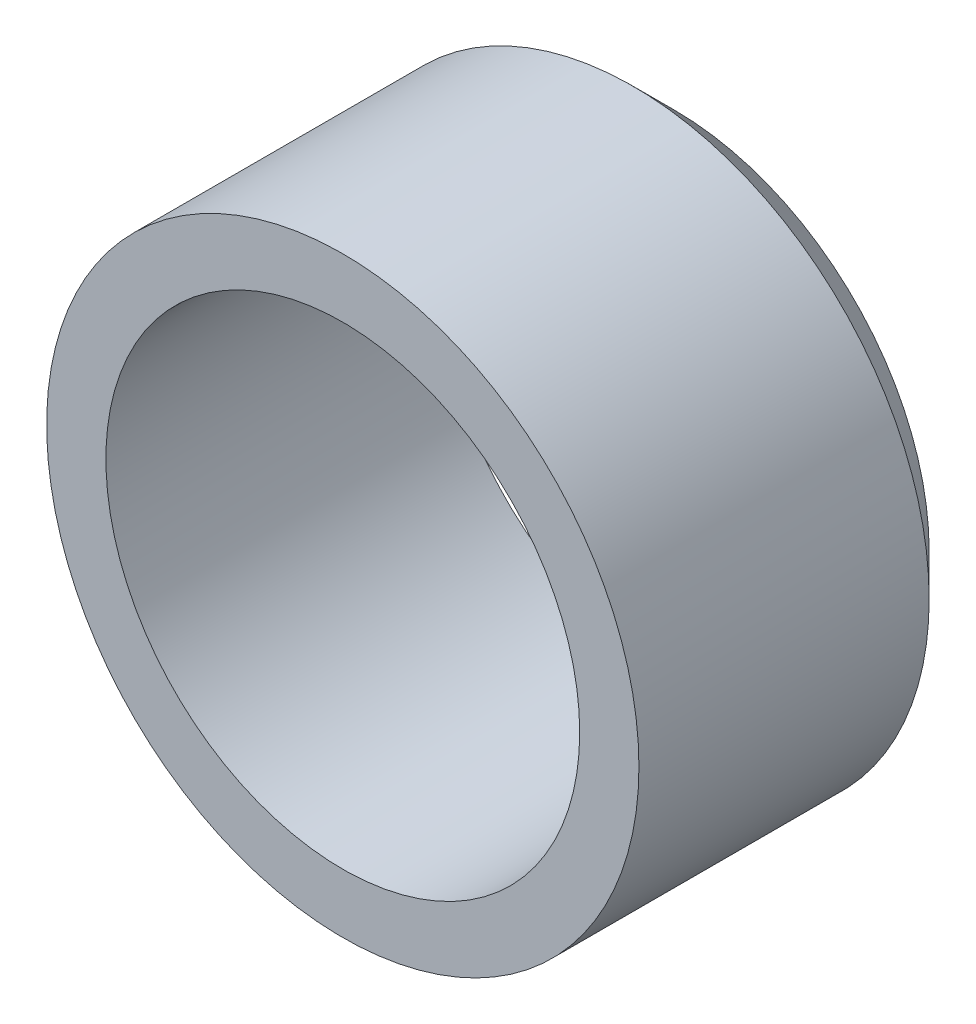
ISO-10303-21;
HEADER;
FILE_DESCRIPTION(('STEP AP214'),'2;1');
FILE_NAME('part.step','',(''),(''),'','','');
FILE_SCHEMA(('AUTOMOTIVE_DESIGN { 1 0 10303 214 1 1 1 1 }'));
ENDSEC;
DATA;
#1=APPLICATION_CONTEXT('core data for automotive mechanical design processes');
#2=APPLICATION_PROTOCOL_DEFINITION('international standard','automotive_design',2000,#1);
#3=PRODUCT_CONTEXT('',#1,'mechanical');
#4=PRODUCT('Part','Part','',(#3));
#5=PRODUCT_RELATED_PRODUCT_CATEGORY('part','',(#4));
#6=PRODUCT_DEFINITION_FORMATION('','',#4);
#7=PRODUCT_DEFINITION_CONTEXT('part definition',#1,'design');
#8=PRODUCT_DEFINITION('design','',#6,#7);
#9=PRODUCT_DEFINITION_SHAPE('','',#8);
#10=(LENGTH_UNIT() NAMED_UNIT(*) SI_UNIT(.MILLI.,.METRE.));
#11=(NAMED_UNIT(*) PLANE_ANGLE_UNIT() SI_UNIT($,.RADIAN.));
#12=(NAMED_UNIT(*) SI_UNIT($,.STERADIAN.) SOLID_ANGLE_UNIT());
#13=UNCERTAINTY_MEASURE_WITH_UNIT(LENGTH_MEASURE(1.E-05),#10,'distance_accuracy_value','');
#14=(GEOMETRIC_REPRESENTATION_CONTEXT(3) GLOBAL_UNCERTAINTY_ASSIGNED_CONTEXT((#13)) GLOBAL_UNIT_ASSIGNED_CONTEXT((#10,
#11,#12)) REPRESENTATION_CONTEXT('',''));
#15=CARTESIAN_POINT('',(0.,0.,0.));
#16=DIRECTION('',(0.,0.,1.));
#17=DIRECTION('',(1.,0.,0.));
#18=AXIS2_PLACEMENT_3D('',#15,#16,#17);
#19=CARTESIAN_POINT('',(0.,2.,0.));
#20=DIRECTION('',(0.,0.,-1.));
#21=DIRECTION('',(-1.,0.,0.));
#22=AXIS2_PLACEMENT_3D('',#19,#20,#21);
#23=PLANE('',#22);
#24=CARTESIAN_POINT('',(0.,0.,0.));
#25=DIRECTION('',(0.,0.,1.));
#26=DIRECTION('',(1.,0.,0.));
#27=AXIS2_PLACEMENT_3D('',#24,#25,#26);
#28=CIRCLE('',#27,2.);
#29=CARTESIAN_POINT('',(2.,0.,0.));
#30=VERTEX_POINT('',#29);
#31=EDGE_CURVE('E46',#30,#30,#28,.T.);
#32=ORIENTED_EDGE('',*,*,#31,.F.);
#33=EDGE_LOOP('',(#32));
#34=FACE_BOUND('',#33,.T.);
#35=CARTESIAN_POINT('',(0.,0.,0.));
#36=DIRECTION('',(0.,0.,1.));
#37=DIRECTION('',(1.,0.,0.));
#38=AXIS2_PLACEMENT_3D('',#35,#36,#37);
#39=CIRCLE('',#38,2.5);
#40=CARTESIAN_POINT('',(2.5,0.,0.));
#41=VERTEX_POINT('',#40);
#42=EDGE_CURVE('E42',#41,#41,#39,.T.);
#43=ORIENTED_EDGE('',*,*,#42,.T.);
#44=EDGE_LOOP('',(#43));
#45=FACE_BOUND('',#44,.T.);
#46=ADVANCED_FACE('F31',(#34,#45),#23,.F.);
#47=CARTESIAN_POINT('',(0.,0.,20.7004155612658));
#48=DIRECTION('',(0.,0.,1.));
#49=DIRECTION('',(1.,0.,0.));
#50=AXIS2_PLACEMENT_3D('',#47,#48,#49);
#51=CYLINDRICAL_SURFACE('',#50,2.5);
#52=CARTESIAN_POINT('',(0.,0.,-2.45));
#53=DIRECTION('',(0.,0.,1.));
#54=DIRECTION('',(1.,0.,0.));
#55=AXIS2_PLACEMENT_3D('',#52,#53,#54);
#56=CIRCLE('',#55,2.5);
#57=CARTESIAN_POINT('',(2.5,0.,-2.45));
#58=VERTEX_POINT('',#57);
#59=EDGE_CURVE('E38',#58,#58,#56,.T.);
#60=ORIENTED_EDGE('',*,*,#59,.T.);
#61=EDGE_LOOP('',(#60));
#62=FACE_BOUND('',#61,.T.);
#63=ORIENTED_EDGE('',*,*,#42,.F.);
#64=EDGE_LOOP('',(#63));
#65=FACE_BOUND('',#64,.T.);
#66=ADVANCED_FACE('F66',(#62,#65),#51,.T.);
#67=CARTESIAN_POINT('',(0.,2.5,-2.8));
#68=DIRECTION('',(0.,0.,1.));
#69=DIRECTION('',(1.,0.,0.));
#70=AXIS2_PLACEMENT_3D('',#67,#68,#69);
#71=PLANE('',#70);
#72=CARTESIAN_POINT('',(0.,0.,-2.8));
#73=DIRECTION('',(0.,0.,1.));
#74=DIRECTION('',(1.,0.,0.));
#75=AXIS2_PLACEMENT_3D('',#72,#73,#74);
#76=CIRCLE('',#75,2.);
#77=CARTESIAN_POINT('',(2.,0.,-2.8));
#78=VERTEX_POINT('',#77);
#79=EDGE_CURVE('E51',#78,#78,#76,.T.);
#80=ORIENTED_EDGE('',*,*,#79,.T.);
#81=EDGE_LOOP('',(#80));
#82=FACE_BOUND('',#81,.T.);
#83=CARTESIAN_POINT('',(0.,0.,-2.8));
#84=DIRECTION('',(0.,0.,1.));
#85=DIRECTION('',(1.,0.,0.));
#86=AXIS2_PLACEMENT_3D('',#83,#84,#85);
#87=CIRCLE('',#86,2.15);
#88=CARTESIAN_POINT('',(2.15,0.,-2.8));
#89=VERTEX_POINT('',#88);
#90=EDGE_CURVE('E10',#89,#89,#87,.F.);
#91=ORIENTED_EDGE('',*,*,#90,.T.);
#92=EDGE_LOOP('',(#91));
#93=FACE_BOUND('',#92,.T.);
#94=ADVANCED_FACE('F55',(#82,#93),#71,.F.);
#95=CARTESIAN_POINT('',(0.,0.,20.7004155612658));
#96=DIRECTION('',(0.,0.,1.));
#97=DIRECTION('',(1.,0.,0.));
#98=AXIS2_PLACEMENT_3D('',#95,#96,#97);
#99=CYLINDRICAL_SURFACE('',#98,2.);
#100=ORIENTED_EDGE('',*,*,#31,.T.);
#101=EDGE_LOOP('',(#100));
#102=FACE_BOUND('',#101,.T.);
#103=ORIENTED_EDGE('',*,*,#79,.F.);
#104=EDGE_LOOP('',(#103));
#105=FACE_BOUND('',#104,.T.);
#106=ADVANCED_FACE('F57',(#102,#105),#99,.F.);
#107=CARTESIAN_POINT('',(0.,0.,-2.45));
#108=DIRECTION('',(0.,0.,1.));
#109=DIRECTION('',(1.,0.,0.));
#110=AXIS2_PLACEMENT_3D('',#107,#108,#109);
#111=CONICAL_SURFACE('',#110,2.5,0.785398163397451);
#112=CARTESIAN_POINT('',(2.15,0.,-2.8));
#113=CARTESIAN_POINT('',(2.15364583333333,0.,-2.79635416666667));
#114=CARTESIAN_POINT('',(2.15729166666667,0.,-2.79270833333333));
#115=CARTESIAN_POINT('',(2.16458333333333,0.,-2.78541666666667));
#116=CARTESIAN_POINT('',(2.16822916666667,0.,-2.78177083333333));
#117=CARTESIAN_POINT('',(2.17552083333333,0.,-2.77447916666667));
#118=CARTESIAN_POINT('',(2.17916666666667,0.,-2.77083333333333));
#119=CARTESIAN_POINT('',(2.18645833333333,0.,-2.76354166666667));
#120=CARTESIAN_POINT('',(2.19010416666667,0.,-2.75989583333333));
#121=CARTESIAN_POINT('',(2.19739583333333,0.,-2.75260416666667));
#122=CARTESIAN_POINT('',(2.20104166666667,0.,-2.74895833333333));
#123=CARTESIAN_POINT('',(2.20833333333333,0.,-2.74166666666667));
#124=CARTESIAN_POINT('',(2.21197916666667,0.,-2.73802083333333));
#125=CARTESIAN_POINT('',(2.21927083333333,0.,-2.73072916666667));
#126=CARTESIAN_POINT('',(2.22291666666667,0.,-2.72708333333333));
#127=CARTESIAN_POINT('',(2.23020833333333,0.,-2.71979166666667));
#128=CARTESIAN_POINT('',(2.23385416666667,0.,-2.71614583333333));
#129=CARTESIAN_POINT('',(2.24114583333333,0.,-2.70885416666667));
#130=CARTESIAN_POINT('',(2.24479166666667,0.,-2.70520833333333));
#131=CARTESIAN_POINT('',(2.25208333333333,0.,-2.69791666666667));
#132=CARTESIAN_POINT('',(2.25572916666667,0.,-2.69427083333333));
#133=CARTESIAN_POINT('',(2.26302083333333,0.,-2.68697916666667));
#134=CARTESIAN_POINT('',(2.26666666666667,0.,-2.68333333333333));
#135=CARTESIAN_POINT('',(2.27395833333333,0.,-2.67604166666667));
#136=CARTESIAN_POINT('',(2.27760416666667,0.,-2.67239583333333));
#137=CARTESIAN_POINT('',(2.28489583333333,0.,-2.66510416666667));
#138=CARTESIAN_POINT('',(2.28854166666667,0.,-2.66145833333333));
#139=CARTESIAN_POINT('',(2.29583333333333,0.,-2.65416666666667));
#140=CARTESIAN_POINT('',(2.29947916666667,0.,-2.65052083333333));
#141=CARTESIAN_POINT('',(2.30677083333333,0.,-2.64322916666667));
#142=CARTESIAN_POINT('',(2.31041666666667,0.,-2.63958333333333));
#143=CARTESIAN_POINT('',(2.31770833333333,0.,-2.63229166666667));
#144=CARTESIAN_POINT('',(2.32135416666667,0.,-2.62864583333333));
#145=CARTESIAN_POINT('',(2.32864583333333,0.,-2.62135416666667));
#146=CARTESIAN_POINT('',(2.33229166666667,0.,-2.61770833333333));
#147=CARTESIAN_POINT('',(2.33958333333333,0.,-2.61041666666667));
#148=CARTESIAN_POINT('',(2.34322916666667,0.,-2.60677083333333));
#149=CARTESIAN_POINT('',(2.35052083333333,0.,-2.59947916666667));
#150=CARTESIAN_POINT('',(2.35416666666667,0.,-2.59583333333333));
#151=CARTESIAN_POINT('',(2.36145833333333,0.,-2.58854166666667));
#152=CARTESIAN_POINT('',(2.36510416666667,0.,-2.58489583333333));
#153=CARTESIAN_POINT('',(2.37239583333333,0.,-2.57760416666667));
#154=CARTESIAN_POINT('',(2.37604166666667,0.,-2.57395833333333));
#155=CARTESIAN_POINT('',(2.38333333333333,0.,-2.56666666666667));
#156=CARTESIAN_POINT('',(2.38697916666667,0.,-2.56302083333333));
#157=CARTESIAN_POINT('',(2.39427083333333,0.,-2.55572916666667));
#158=CARTESIAN_POINT('',(2.39791666666667,0.,-2.55208333333333));
#159=CARTESIAN_POINT('',(2.40520833333333,0.,-2.54479166666667));
#160=CARTESIAN_POINT('',(2.40885416666667,0.,-2.54114583333333));
#161=CARTESIAN_POINT('',(2.41614583333333,0.,-2.53385416666667));
#162=CARTESIAN_POINT('',(2.41979166666667,0.,-2.53020833333333));
#163=CARTESIAN_POINT('',(2.42708333333333,0.,-2.52291666666667));
#164=CARTESIAN_POINT('',(2.43072916666667,0.,-2.51927083333333));
#165=CARTESIAN_POINT('',(2.43802083333333,0.,-2.51197916666667));
#166=CARTESIAN_POINT('',(2.44166666666667,0.,-2.50833333333333));
#167=CARTESIAN_POINT('',(2.44895833333333,0.,-2.50104166666667));
#168=CARTESIAN_POINT('',(2.45260416666667,0.,-2.49739583333333));
#169=CARTESIAN_POINT('',(2.45989583333333,0.,-2.49010416666667));
#170=CARTESIAN_POINT('',(2.46354166666667,0.,-2.48645833333333));
#171=CARTESIAN_POINT('',(2.47083333333333,0.,-2.47916666666667));
#172=CARTESIAN_POINT('',(2.47447916666667,0.,-2.47552083333333));
#173=CARTESIAN_POINT('',(2.48177083333333,0.,-2.46822916666667));
#174=CARTESIAN_POINT('',(2.48541666666667,0.,-2.46458333333333));
#175=CARTESIAN_POINT('',(2.49270833333333,0.,-2.45729166666667));
#176=CARTESIAN_POINT('',(2.49635416666667,0.,-2.45364583333333));
#177=CARTESIAN_POINT('',(2.5,0.,-2.45));
#178=B_SPLINE_CURVE_WITH_KNOTS('',3,(#112,#113,#114,#115,#116,#117,#118,#119,#120,#121,#122,
#123,#124,#125,#126,#127,#128,#129,#130,#131,#132,#133,#134,#135,#136,#137,#138,#139,#140,#141,
#142,#143,#144,#145,#146,#147,#148,#149,#150,#151,#152,#153,#154,#155,#156,#157,#158,#159,#160,
#161,#162,#163,#164,#165,#166,#167,#168,#169,#170,#171,#172,#173,#174,#175,#176,#177),
.UNSPECIFIED.,.F.,.F.,(4,2,2,2,2,2,2,2,2,2,2,2,2,2,2,2,2,2,2,2,2,2,2,2,2,2,2,2,2,2,2,2,4),(0.,
0.0154679608384556,0.0309359216769114,0.0464038825153673,0.0618718433538231,0.0773398041922787,
0.0928077650307346,0.10827572586919,0.123743686707646,0.139211647546102,0.154679608384557,
0.170147569223013,0.185615530061469,0.201083490899925,0.21655145173838,0.232019412576836,
0.247487373415292,0.262955334253748,0.278423295092203,0.293891255930659,0.309359216769114,
0.32482717760757,0.340295138446026,0.355763099284482,0.371231060122938,0.386699020961393,
0.402166981799849,0.417634942638305,0.43310290347676,0.448570864315216,0.464038825153672,
0.479506785992128,0.494974746830583),.UNSPECIFIED.);
#179=EDGE_CURVE('BSEAM33',#89,#58,#178,.T.);
#180=ORIENTED_EDGE('',*,*,#90,.F.);
#181=ORIENTED_EDGE('',*,*,#59,.F.);
#182=ORIENTED_EDGE('',*,*,#179,.T.);
#183=ORIENTED_EDGE('',*,*,#179,.F.);
#184=EDGE_LOOP('',(#180,#182,#181,#183));
#185=FACE_BOUND('',#184,.T.);
#186=ADVANCED_FACE('F33',(#185),#111,.T.);
#187=CLOSED_SHELL('',(#46,#66,#94,#106,#186));
#188=MANIFOLD_SOLID_BREP('B2',#187);
#189=ADVANCED_BREP_SHAPE_REPRESENTATION('',(#18,#188),#14);
#190=SHAPE_DEFINITION_REPRESENTATION(#9,#189);
ENDSEC;
END-ISO-10303-21;
